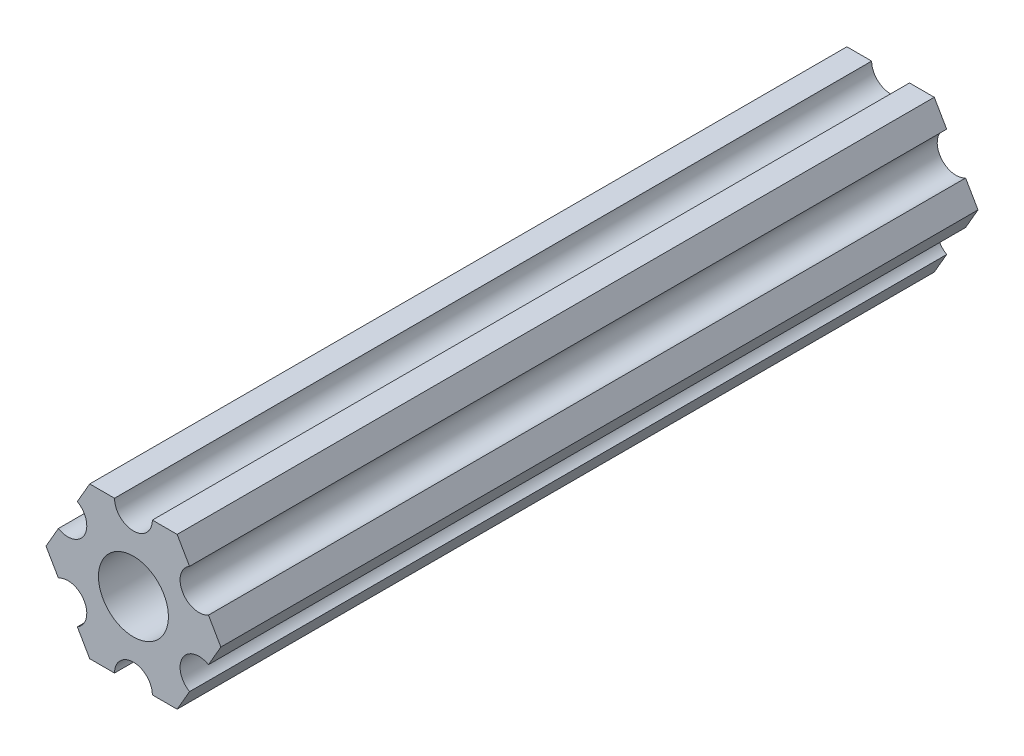
ISO-10303-21;
HEADER;
FILE_DESCRIPTION(('STEP AP214'),'2;1');
FILE_NAME('part.step','',(''),(''),'','','');
FILE_SCHEMA(('AUTOMOTIVE_DESIGN { 1 0 10303 214 1 1 1 1 }'));
ENDSEC;
DATA;
#1=APPLICATION_CONTEXT('core data for automotive mechanical design processes');
#2=APPLICATION_PROTOCOL_DEFINITION('international standard','automotive_design',2000,#1);
#3=PRODUCT_CONTEXT('',#1,'mechanical');
#4=PRODUCT('Part','Part','',(#3));
#5=PRODUCT_RELATED_PRODUCT_CATEGORY('part','',(#4));
#6=PRODUCT_DEFINITION_FORMATION('','',#4);
#7=PRODUCT_DEFINITION_CONTEXT('part definition',#1,'design');
#8=PRODUCT_DEFINITION('design','',#6,#7);
#9=PRODUCT_DEFINITION_SHAPE('','',#8);
#10=(LENGTH_UNIT() NAMED_UNIT(*) SI_UNIT(.MILLI.,.METRE.));
#11=(NAMED_UNIT(*) PLANE_ANGLE_UNIT() SI_UNIT($,.RADIAN.));
#12=(NAMED_UNIT(*) SI_UNIT($,.STERADIAN.) SOLID_ANGLE_UNIT());
#13=UNCERTAINTY_MEASURE_WITH_UNIT(LENGTH_MEASURE(1.E-05),#10,'distance_accuracy_value','');
#14=(GEOMETRIC_REPRESENTATION_CONTEXT(3) GLOBAL_UNCERTAINTY_ASSIGNED_CONTEXT((#13)) GLOBAL_UNIT_ASSIGNED_CONTEXT((#10,
#11,#12)) REPRESENTATION_CONTEXT('',''));
#15=CARTESIAN_POINT('',(0.,0.,0.));
#16=DIRECTION('',(0.,0.,1.));
#17=DIRECTION('',(1.,0.,0.));
#18=AXIS2_PLACEMENT_3D('',#15,#16,#17);
#19=CARTESIAN_POINT('',(5.49926169873049,-3.17500022210629,241.3));
#20=DIRECTION('',(0.,0.,1.));
#21=DIRECTION('',(1.,0.,0.));
#22=AXIS2_PLACEMENT_3D('',#19,#20,#21);
#23=CYLINDRICAL_SURFACE('',#22,1.5875);
#24=CARTESIAN_POINT('',(5.49926169873049,-3.17500022210629,304.8));
#25=DIRECTION('',(0.,0.,-1.));
#26=DIRECTION('',(-1.,0.,0.));
#27=AXIS2_PLACEMENT_3D('',#24,#25,#26);
#28=CIRCLE('',#27,1.5875);
#29=CARTESIAN_POINT('',(4.7055116987305,-4.5498155506141,304.8));
#30=VERTEX_POINT('',#29);
#31=CARTESIAN_POINT('',(6.29301169873047,-1.80018489359848,304.8));
#32=VERTEX_POINT('',#31);
#33=EDGE_CURVE('E193',#30,#32,#28,.T.);
#34=ORIENTED_EDGE('',*,*,#33,.F.);
#35=DIRECTION('',(0.,0.,1.));
#36=VECTOR('',#35,1.);
#37=CARTESIAN_POINT('',(4.7055116987305,-4.5498155506141,241.3));
#38=LINE('',#37,#36);
#39=CARTESIAN_POINT('',(4.7055116987305,-4.5498155506141,241.3));
#40=VERTEX_POINT('',#39);
#41=EDGE_CURVE('E11',#40,#30,#38,.T.);
#42=ORIENTED_EDGE('',*,*,#41,.F.);
#43=CARTESIAN_POINT('',(5.49926169873049,-3.17500022210629,241.3));
#44=DIRECTION('',(0.,0.,-1.));
#45=DIRECTION('',(-1.,0.,0.));
#46=AXIS2_PLACEMENT_3D('',#43,#44,#45);
#47=CIRCLE('',#46,1.5875);
#48=CARTESIAN_POINT('',(6.29301169873047,-1.80018489359848,241.3));
#49=VERTEX_POINT('',#48);
#50=EDGE_CURVE('E244',#40,#49,#47,.T.);
#51=ORIENTED_EDGE('',*,*,#50,.T.);
#52=DIRECTION('',(0.,0.,1.));
#53=VECTOR('',#52,1.);
#54=CARTESIAN_POINT('',(6.29301169873047,-1.80018489359848,241.3));
#55=LINE('',#54,#53);
#56=EDGE_CURVE('E39',#49,#32,#55,.T.);
#57=ORIENTED_EDGE('',*,*,#56,.T.);
#58=EDGE_LOOP('',(#34,#42,#51,#57));
#59=FACE_BOUND('',#58,.T.);
#60=ADVANCED_FACE('F36',(#59),#23,.F.);
#61=CARTESIAN_POINT('',(3.6661745940535,-6.35000022210627,241.3));
#62=DIRECTION('',(0.866025403784446,-0.499999999999988,0.));
#63=DIRECTION('',(0.499999999999988,0.866025403784446,0.));
#64=AXIS2_PLACEMENT_3D('',#61,#62,#63);
#65=PLANE('',#64);
#66=DIRECTION('',(0.499999999999988,0.866025403784446,0.));
#67=VECTOR('',#66,1.);
#68=CARTESIAN_POINT('',(3.6661745940535,-6.35000022210627,304.8));
#69=LINE('',#68,#67);
#70=CARTESIAN_POINT('',(3.6661745940535,-6.35000022210627,304.8));
#71=VERTEX_POINT('',#70);
#72=EDGE_CURVE('E242',#71,#30,#69,.T.);
#73=ORIENTED_EDGE('',*,*,#72,.F.);
#74=DIRECTION('',(0.,0.,1.));
#75=VECTOR('',#74,1.);
#76=CARTESIAN_POINT('',(3.6661745940535,-6.35000022210627,241.3));
#77=LINE('',#76,#75);
#78=CARTESIAN_POINT('',(3.6661745940535,-6.35000022210627,241.3));
#79=VERTEX_POINT('',#78);
#80=EDGE_CURVE('E45',#79,#71,#77,.T.);
#81=ORIENTED_EDGE('',*,*,#80,.F.);
#82=DIRECTION('',(0.499999999999988,0.866025403784446,0.));
#83=VECTOR('',#82,1.);
#84=CARTESIAN_POINT('',(3.6661745940535,-6.35000022210627,241.3));
#85=LINE('',#84,#83);
#86=EDGE_CURVE('E183',#79,#40,#85,.T.);
#87=ORIENTED_EDGE('',*,*,#86,.T.);
#88=ORIENTED_EDGE('',*,*,#41,.T.);
#89=EDGE_LOOP('',(#73,#81,#87,#88));
#90=FACE_BOUND('',#89,.T.);
#91=ADVANCED_FACE('F276',(#90),#65,.T.);
#92=CARTESIAN_POINT('',(1.58750038469929,-6.35000022210627,241.3));
#93=DIRECTION('',(0.,-1.,0.));
#94=DIRECTION('',(0.,0.,-1.));
#95=AXIS2_PLACEMENT_3D('',#92,#93,#94);
#96=PLANE('',#95);
#97=DIRECTION('',(1.,0.,0.));
#98=VECTOR('',#97,1.);
#99=CARTESIAN_POINT('',(1.58750038469929,-6.35000022210627,304.8));
#100=LINE('',#99,#98);
#101=CARTESIAN_POINT('',(1.58750038469929,-6.35000022210627,304.8));
#102=VERTEX_POINT('',#101);
#103=EDGE_CURVE('E170',#102,#71,#100,.T.);
#104=ORIENTED_EDGE('',*,*,#103,.F.);
#105=DIRECTION('',(0.,0.,1.));
#106=VECTOR('',#105,1.);
#107=CARTESIAN_POINT('',(1.58750038469929,-6.35000022210627,241.3));
#108=LINE('',#107,#106);
#109=CARTESIAN_POINT('',(1.58750038469929,-6.35000022210627,241.3));
#110=VERTEX_POINT('',#109);
#111=EDGE_CURVE('E165',#110,#102,#108,.T.);
#112=ORIENTED_EDGE('',*,*,#111,.F.);
#113=DIRECTION('',(1.,0.,0.));
#114=VECTOR('',#113,1.);
#115=CARTESIAN_POINT('',(1.58750038469929,-6.35000022210627,241.3));
#116=LINE('',#115,#114);
#117=EDGE_CURVE('E168',#110,#79,#116,.T.);
#118=ORIENTED_EDGE('',*,*,#117,.T.);
#119=ORIENTED_EDGE('',*,*,#80,.T.);
#120=EDGE_LOOP('',(#104,#112,#118,#119));
#121=FACE_BOUND('',#120,.T.);
#122=ADVANCED_FACE('F167',(#121),#96,.T.);
#123=CARTESIAN_POINT('',(3.84699290671026E-07,-6.35000022210627,241.3));
#124=DIRECTION('',(0.,0.,1.));
#125=DIRECTION('',(1.,0.,0.));
#126=AXIS2_PLACEMENT_3D('',#123,#124,#125);
#127=CYLINDRICAL_SURFACE('',#126,1.5875);
#128=CARTESIAN_POINT('',(3.84699290671026E-07,-6.35000022210627,304.8));
#129=DIRECTION('',(0.,0.,-1.));
#130=DIRECTION('',(-1.,0.,0.));
#131=AXIS2_PLACEMENT_3D('',#128,#129,#130);
#132=CIRCLE('',#131,1.5875);
#133=CARTESIAN_POINT('',(-1.58749961530071,-6.35000022210627,304.8));
#134=VERTEX_POINT('',#133);
#135=EDGE_CURVE('E239',#134,#102,#132,.T.);
#136=ORIENTED_EDGE('',*,*,#135,.F.);
#137=DIRECTION('',(0.,0.,1.));
#138=VECTOR('',#137,1.);
#139=CARTESIAN_POINT('',(-1.58749961530071,-6.35000022210627,241.3));
#140=LINE('',#139,#138);
#141=CARTESIAN_POINT('',(-1.58749961530071,-6.35000022210627,241.3));
#142=VERTEX_POINT('',#141);
#143=EDGE_CURVE('E175',#142,#134,#140,.T.);
#144=ORIENTED_EDGE('',*,*,#143,.F.);
#145=CARTESIAN_POINT('',(3.84699290671026E-07,-6.35000022210627,241.3));
#146=DIRECTION('',(0.,0.,-1.));
#147=DIRECTION('',(-1.,0.,0.));
#148=AXIS2_PLACEMENT_3D('',#145,#146,#147);
#149=CIRCLE('',#148,1.5875);
#150=EDGE_CURVE('E181',#142,#110,#149,.T.);
#151=ORIENTED_EDGE('',*,*,#150,.T.);
#152=ORIENTED_EDGE('',*,*,#111,.T.);
#153=EDGE_LOOP('',(#136,#144,#151,#152));
#154=FACE_BOUND('',#153,.T.);
#155=ADVANCED_FACE('F185',(#154),#127,.F.);
#156=CARTESIAN_POINT('',(-3.66617382465478,-6.35000022210627,241.3));
#157=DIRECTION('',(0.,-1.,0.));
#158=DIRECTION('',(1.,0.,0.));
#159=AXIS2_PLACEMENT_3D('',#156,#157,#158);
#160=PLANE('',#159);
#161=DIRECTION('',(1.,0.,0.));
#162=VECTOR('',#161,1.);
#163=CARTESIAN_POINT('',(-3.66617382465478,-6.35000022210627,304.8));
#164=LINE('',#163,#162);
#165=CARTESIAN_POINT('',(-3.66617382465478,-6.35000022210627,304.8));
#166=VERTEX_POINT('',#165);
#167=EDGE_CURVE('E236',#166,#134,#164,.T.);
#168=ORIENTED_EDGE('',*,*,#167,.F.);
#169=DIRECTION('',(0.,0.,1.));
#170=VECTOR('',#169,1.);
#171=CARTESIAN_POINT('',(-3.66617382465478,-6.35000022210627,241.3));
#172=LINE('',#171,#170);
#173=CARTESIAN_POINT('',(-3.66617382465478,-6.35000022210627,241.3));
#174=VERTEX_POINT('',#173);
#175=EDGE_CURVE('E248',#174,#166,#172,.T.);
#176=ORIENTED_EDGE('',*,*,#175,.F.);
#177=DIRECTION('',(1.,0.,0.));
#178=VECTOR('',#177,1.);
#179=CARTESIAN_POINT('',(-3.66617382465478,-6.35000022210627,241.3));
#180=LINE('',#179,#178);
#181=EDGE_CURVE('E186',#174,#142,#180,.T.);
#182=ORIENTED_EDGE('',*,*,#181,.T.);
#183=ORIENTED_EDGE('',*,*,#143,.T.);
#184=EDGE_LOOP('',(#168,#176,#182,#183));
#185=FACE_BOUND('',#184,.T.);
#186=ADVANCED_FACE('F289',(#185),#160,.T.);
#187=CARTESIAN_POINT('',(-4.70551103839171,-4.54981561357971,241.3));
#188=DIRECTION('',(-0.866025373493149,-0.500000052466048,0.));
#189=DIRECTION('',(0.500000052466048,-0.866025373493149,0.));
#190=AXIS2_PLACEMENT_3D('',#187,#188,#189);
#191=PLANE('',#190);
#192=DIRECTION('',(0.500000052466048,-0.866025373493149,0.));
#193=VECTOR('',#192,1.);
#194=CARTESIAN_POINT('',(-4.70551103839171,-4.54981561357971,304.8));
#195=LINE('',#194,#193);
#196=CARTESIAN_POINT('',(-4.70551103839171,-4.54981561357971,304.8));
#197=VERTEX_POINT('',#196);
#198=EDGE_CURVE('E233',#197,#166,#195,.T.);
#199=ORIENTED_EDGE('',*,*,#198,.F.);
#200=DIRECTION('',(0.,0.,1.));
#201=VECTOR('',#200,1.);
#202=CARTESIAN_POINT('',(-4.70551103839171,-4.54981561357971,241.3));
#203=LINE('',#202,#201);
#204=CARTESIAN_POINT('',(-4.70551103839171,-4.54981561357971,241.3));
#205=VERTEX_POINT('',#204);
#206=EDGE_CURVE('E250',#205,#197,#203,.T.);
#207=ORIENTED_EDGE('',*,*,#206,.F.);
#208=DIRECTION('',(0.500000052466048,-0.866025373493149,0.));
#209=VECTOR('',#208,1.);
#210=CARTESIAN_POINT('',(-4.70551103839171,-4.54981561357971,241.3));
#211=LINE('',#210,#209);
#212=EDGE_CURVE('E188',#205,#174,#211,.T.);
#213=ORIENTED_EDGE('',*,*,#212,.T.);
#214=ORIENTED_EDGE('',*,*,#175,.T.);
#215=EDGE_LOOP('',(#199,#207,#213,#214));
#216=FACE_BOUND('',#215,.T.);
#217=ADVANCED_FACE('F292',(#216),#191,.T.);
#218=CARTESIAN_POINT('',(-5.49926112168156,-3.17500033315934,241.3));
#219=DIRECTION('',(0.,0.,1.));
#220=DIRECTION('',(1.,0.,0.));
#221=AXIS2_PLACEMENT_3D('',#218,#219,#220);
#222=CYLINDRICAL_SURFACE('',#221,1.5875);
#223=CARTESIAN_POINT('',(-5.49926112168156,-3.17500033315934,304.8));
#224=DIRECTION('',(0.,0.,-1.));
#225=DIRECTION('',(-1.,0.,0.));
#226=AXIS2_PLACEMENT_3D('',#223,#224,#225);
#227=CIRCLE('',#226,1.5875);
#228=CARTESIAN_POINT('',(-6.29301120497141,-1.80018505273897,304.8));
#229=VERTEX_POINT('',#228);
#230=EDGE_CURVE('E230',#229,#197,#227,.T.);
#231=ORIENTED_EDGE('',*,*,#230,.F.);
#232=DIRECTION('',(0.,0.,1.));
#233=VECTOR('',#232,1.);
#234=CARTESIAN_POINT('',(-6.29301120497141,-1.80018505273897,241.3));
#235=LINE('',#234,#233);
#236=CARTESIAN_POINT('',(-6.29301120497141,-1.80018505273897,241.3));
#237=VERTEX_POINT('',#236);
#238=EDGE_CURVE('E252',#237,#229,#235,.T.);
#239=ORIENTED_EDGE('',*,*,#238,.F.);
#240=CARTESIAN_POINT('',(-5.49926112168156,-3.17500033315934,241.3));
#241=DIRECTION('',(0.,0.,-1.));
#242=DIRECTION('',(-1.,0.,0.));
#243=AXIS2_PLACEMENT_3D('',#240,#241,#242);
#244=CIRCLE('',#243,1.5875);
#245=EDGE_CURVE('E397',#237,#205,#244,.T.);
#246=ORIENTED_EDGE('',*,*,#245,.T.);
#247=ORIENTED_EDGE('',*,*,#206,.T.);
#248=EDGE_LOOP('',(#231,#239,#246,#247));
#249=FACE_BOUND('',#248,.T.);
#250=ADVANCED_FACE('F296',(#249),#222,.F.);
#251=CARTESIAN_POINT('',(-7.33234841870827,-4.44212523790841E-07,241.3));
#252=DIRECTION('',(-0.866025373493149,-0.500000052466048,0.));
#253=DIRECTION('',(0.500000052466048,-0.86602537349315,0.));
#254=AXIS2_PLACEMENT_3D('',#251,#252,#253);
#255=PLANE('',#254);
#256=DIRECTION('',(0.500000052466048,-0.86602537349315,0.));
#257=VECTOR('',#256,1.);
#258=CARTESIAN_POINT('',(-7.33234841870827,-4.44212523790841E-07,304.8));
#259=LINE('',#258,#257);
#260=CARTESIAN_POINT('',(-7.33234841870827,-4.44212523790841E-07,304.8));
#261=VERTEX_POINT('',#260);
#262=EDGE_CURVE('E227',#261,#229,#259,.T.);
#263=ORIENTED_EDGE('',*,*,#262,.F.);
#264=DIRECTION('',(0.,0.,1.));
#265=VECTOR('',#264,1.);
#266=CARTESIAN_POINT('',(-7.33234841870827,-4.44212523790841E-07,241.3));
#267=LINE('',#266,#265);
#268=CARTESIAN_POINT('',(-7.33234841870827,-4.44212523790841E-07,241.3));
#269=VERTEX_POINT('',#268);
#270=EDGE_CURVE('E254',#269,#261,#267,.T.);
#271=ORIENTED_EDGE('',*,*,#270,.F.);
#272=DIRECTION('',(0.500000052466048,-0.86602537349315,0.));
#273=VECTOR('',#272,1.);
#274=CARTESIAN_POINT('',(-7.33234841870827,-4.44212523790841E-07,241.3));
#275=LINE('',#274,#273);
#276=EDGE_CURVE('E394',#269,#237,#275,.T.);
#277=ORIENTED_EDGE('',*,*,#276,.T.);
#278=ORIENTED_EDGE('',*,*,#238,.T.);
#279=EDGE_LOOP('',(#263,#271,#277,#278));
#280=FACE_BOUND('',#279,.T.);
#281=ADVANCED_FACE('F300',(#280),#255,.T.);
#282=CARTESIAN_POINT('',(-6.29301142309098,1.80018429024547,241.3));
#283=DIRECTION('',(-0.866025434075722,0.499999947533955,0.));
#284=DIRECTION('',(-0.499999947533955,-0.866025434075722,0.));
#285=AXIS2_PLACEMENT_3D('',#282,#283,#284);
#286=PLANE('',#285);
#287=DIRECTION('',(-0.499999947533955,-0.866025434075722,0.));
#288=VECTOR('',#287,1.);
#289=CARTESIAN_POINT('',(-6.29301142309098,1.80018429024547,304.8));
#290=LINE('',#289,#288);
#291=CARTESIAN_POINT('',(-6.29301142309098,1.80018429024546,304.8));
#292=VERTEX_POINT('',#291);
#293=EDGE_CURVE('E224',#292,#261,#290,.T.);
#294=ORIENTED_EDGE('',*,*,#293,.F.);
#295=DIRECTION('',(0.,0.,1.));
#296=VECTOR('',#295,1.);
#297=CARTESIAN_POINT('',(-6.29301142309098,1.80018429024546,241.3));
#298=LINE('',#297,#296);
#299=CARTESIAN_POINT('',(-6.29301142309098,1.80018429024546,241.3));
#300=VERTEX_POINT('',#299);
#301=EDGE_CURVE('E256',#300,#292,#298,.T.);
#302=ORIENTED_EDGE('',*,*,#301,.F.);
#303=DIRECTION('',(-0.499999947533955,-0.866025434075722,0.));
#304=VECTOR('',#303,1.);
#305=CARTESIAN_POINT('',(-6.29301142309098,1.80018429024547,241.3));
#306=LINE('',#305,#304);
#307=EDGE_CURVE('E391',#300,#269,#306,.T.);
#308=ORIENTED_EDGE('',*,*,#307,.T.);
#309=ORIENTED_EDGE('',*,*,#270,.T.);
#310=EDGE_LOOP('',(#294,#302,#308,#309));
#311=FACE_BOUND('',#310,.T.);
#312=ADVANCED_FACE('F304',(#311),#286,.T.);
#313=CARTESIAN_POINT('',(-5.49926150638083,3.17499966684067,241.3));
#314=DIRECTION('',(0.,0.,1.));
#315=DIRECTION('',(1.,0.,0.));
#316=AXIS2_PLACEMENT_3D('',#313,#314,#315);
#317=CYLINDRICAL_SURFACE('',#316,1.5875);
#318=CARTESIAN_POINT('',(-5.49926150638083,3.17499966684067,304.8));
#319=DIRECTION('',(0.,0.,-1.));
#320=DIRECTION('',(-1.,0.,0.));
#321=AXIS2_PLACEMENT_3D('',#318,#319,#320);
#322=CIRCLE('',#321,1.5875);
#323=CARTESIAN_POINT('',(-4.70551158967067,4.54981504343588,304.8));
#324=VERTEX_POINT('',#323);
#325=EDGE_CURVE('E221',#324,#292,#322,.T.);
#326=ORIENTED_EDGE('',*,*,#325,.F.);
#327=DIRECTION('',(0.,0.,1.));
#328=VECTOR('',#327,1.);
#329=CARTESIAN_POINT('',(-4.70551158967067,4.54981504343588,241.3));
#330=LINE('',#329,#328);
#331=CARTESIAN_POINT('',(-4.70551158967067,4.54981504343588,241.3));
#332=VERTEX_POINT('',#331);
#333=EDGE_CURVE('E258',#332,#324,#330,.T.);
#334=ORIENTED_EDGE('',*,*,#333,.F.);
#335=CARTESIAN_POINT('',(-5.49926150638083,3.17499966684067,241.3));
#336=DIRECTION('',(0.,0.,-1.));
#337=DIRECTION('',(-1.,0.,0.));
#338=AXIS2_PLACEMENT_3D('',#335,#336,#337);
#339=CIRCLE('',#338,1.5875);
#340=EDGE_CURVE('E388',#332,#300,#339,.T.);
#341=ORIENTED_EDGE('',*,*,#340,.T.);
#342=ORIENTED_EDGE('',*,*,#301,.T.);
#343=EDGE_LOOP('',(#326,#334,#341,#342));
#344=FACE_BOUND('',#343,.T.);
#345=ADVANCED_FACE('F308',(#344),#317,.F.);
#346=CARTESIAN_POINT('',(-3.66617459405348,6.3499997778937,241.3));
#347=DIRECTION('',(-0.866025434075722,0.499999947533955,0.));
#348=DIRECTION('',(-0.499999947533955,-0.866025434075722,0.));
#349=AXIS2_PLACEMENT_3D('',#346,#347,#348);
#350=PLANE('',#349);
#351=DIRECTION('',(-0.499999947533955,-0.866025434075722,0.));
#352=VECTOR('',#351,1.);
#353=CARTESIAN_POINT('',(-3.66617459405348,6.3499997778937,304.8));
#354=LINE('',#353,#352);
#355=CARTESIAN_POINT('',(-3.66617459405348,6.3499997778937,304.8));
#356=VERTEX_POINT('',#355);
#357=EDGE_CURVE('E218',#356,#324,#354,.T.);
#358=ORIENTED_EDGE('',*,*,#357,.F.);
#359=DIRECTION('',(0.,0.,1.));
#360=VECTOR('',#359,1.);
#361=CARTESIAN_POINT('',(-3.66617459405348,6.3499997778937,241.3));
#362=LINE('',#361,#360);
#363=CARTESIAN_POINT('',(-3.66617459405348,6.3499997778937,241.3));
#364=VERTEX_POINT('',#363);
#365=EDGE_CURVE('E260',#364,#356,#362,.T.);
#366=ORIENTED_EDGE('',*,*,#365,.F.);
#367=DIRECTION('',(-0.499999947533955,-0.866025434075722,0.));
#368=VECTOR('',#367,1.);
#369=CARTESIAN_POINT('',(-3.66617459405348,6.3499997778937,241.3));
#370=LINE('',#369,#368);
#371=EDGE_CURVE('E385',#364,#332,#370,.T.);
#372=ORIENTED_EDGE('',*,*,#371,.T.);
#373=ORIENTED_EDGE('',*,*,#333,.T.);
#374=EDGE_LOOP('',(#358,#366,#372,#373));
#375=FACE_BOUND('',#374,.T.);
#376=ADVANCED_FACE('F312',(#375),#350,.T.);
#377=CARTESIAN_POINT('',(-1.58750038469926,6.3499997778937,241.3));
#378=DIRECTION('',(0.,1.,0.));
#379=DIRECTION('',(0.,0.,1.));
#380=AXIS2_PLACEMENT_3D('',#377,#378,#379);
#381=PLANE('',#380);
#382=DIRECTION('',(-1.,0.,0.));
#383=VECTOR('',#382,1.);
#384=CARTESIAN_POINT('',(-1.58750038469926,6.3499997778937,304.8));
#385=LINE('',#384,#383);
#386=CARTESIAN_POINT('',(-1.58750038469926,6.3499997778937,304.8));
#387=VERTEX_POINT('',#386);
#388=EDGE_CURVE('E215',#387,#356,#385,.T.);
#389=ORIENTED_EDGE('',*,*,#388,.F.);
#390=DIRECTION('',(0.,0.,1.));
#391=VECTOR('',#390,1.);
#392=CARTESIAN_POINT('',(-1.58750038469926,6.3499997778937,241.3));
#393=LINE('',#392,#391);
#394=CARTESIAN_POINT('',(-1.58750038469926,6.3499997778937,241.3));
#395=VERTEX_POINT('',#394);
#396=EDGE_CURVE('E262',#395,#387,#393,.T.);
#397=ORIENTED_EDGE('',*,*,#396,.F.);
#398=DIRECTION('',(-1.,0.,0.));
#399=VECTOR('',#398,1.);
#400=CARTESIAN_POINT('',(-1.58750038469926,6.3499997778937,241.3));
#401=LINE('',#400,#399);
#402=EDGE_CURVE('E382',#395,#364,#401,.T.);
#403=ORIENTED_EDGE('',*,*,#402,.T.);
#404=ORIENTED_EDGE('',*,*,#365,.T.);
#405=EDGE_LOOP('',(#389,#397,#403,#404));
#406=FACE_BOUND('',#405,.T.);
#407=ADVANCED_FACE('F316',(#406),#381,.T.);
#408=CARTESIAN_POINT('',(-3.84699252021695E-07,6.3499997778937,241.3));
#409=DIRECTION('',(0.,0.,1.));
#410=DIRECTION('',(1.,0.,0.));
#411=AXIS2_PLACEMENT_3D('',#408,#409,#410);
#412=CYLINDRICAL_SURFACE('',#411,1.5875);
#413=CARTESIAN_POINT('',(-3.84699252021695E-07,6.3499997778937,304.8));
#414=DIRECTION('',(0.,0.,-1.));
#415=DIRECTION('',(-1.,0.,0.));
#416=AXIS2_PLACEMENT_3D('',#413,#414,#415);
#417=CIRCLE('',#416,1.5875);
#418=CARTESIAN_POINT('',(1.58749961530075,6.3499997778937,304.8));
#419=VERTEX_POINT('',#418);
#420=EDGE_CURVE('E212',#419,#387,#417,.T.);
#421=ORIENTED_EDGE('',*,*,#420,.F.);
#422=DIRECTION('',(0.,0.,1.));
#423=VECTOR('',#422,1.);
#424=CARTESIAN_POINT('',(1.58749961530075,6.3499997778937,241.3));
#425=LINE('',#424,#423);
#426=CARTESIAN_POINT('',(1.58749961530075,6.3499997778937,241.3));
#427=VERTEX_POINT('',#426);
#428=EDGE_CURVE('E264',#427,#419,#425,.T.);
#429=ORIENTED_EDGE('',*,*,#428,.F.);
#430=CARTESIAN_POINT('',(-3.84699252021695E-07,6.3499997778937,241.3));
#431=DIRECTION('',(0.,0.,-1.));
#432=DIRECTION('',(-1.,0.,0.));
#433=AXIS2_PLACEMENT_3D('',#430,#431,#432);
#434=CIRCLE('',#433,1.5875);
#435=EDGE_CURVE('E379',#427,#395,#434,.T.);
#436=ORIENTED_EDGE('',*,*,#435,.T.);
#437=ORIENTED_EDGE('',*,*,#396,.T.);
#438=EDGE_LOOP('',(#421,#429,#436,#437));
#439=FACE_BOUND('',#438,.T.);
#440=ADVANCED_FACE('F320',(#439),#412,.F.);
#441=CARTESIAN_POINT('',(3.66617382465482,6.3499997778937,241.3));
#442=DIRECTION('',(0.,1.,0.));
#443=DIRECTION('',(0.,0.,1.));
#444=AXIS2_PLACEMENT_3D('',#441,#442,#443);
#445=PLANE('',#444);
#446=DIRECTION('',(-1.,0.,0.));
#447=VECTOR('',#446,1.);
#448=CARTESIAN_POINT('',(3.66617382465482,6.3499997778937,304.8));
#449=LINE('',#448,#447);
#450=CARTESIAN_POINT('',(3.66617382465482,6.3499997778937,304.8));
#451=VERTEX_POINT('',#450);
#452=EDGE_CURVE('E209',#451,#419,#449,.T.);
#453=ORIENTED_EDGE('',*,*,#452,.F.);
#454=DIRECTION('',(0.,0.,1.));
#455=VECTOR('',#454,1.);
#456=CARTESIAN_POINT('',(3.66617382465482,6.3499997778937,241.3));
#457=LINE('',#456,#455);
#458=CARTESIAN_POINT('',(3.66617382465482,6.3499997778937,241.3));
#459=VERTEX_POINT('',#458);
#460=EDGE_CURVE('E266',#459,#451,#457,.T.);
#461=ORIENTED_EDGE('',*,*,#460,.F.);
#462=DIRECTION('',(-1.,0.,0.));
#463=VECTOR('',#462,1.);
#464=CARTESIAN_POINT('',(3.66617382465482,6.3499997778937,241.3));
#465=LINE('',#464,#463);
#466=EDGE_CURVE('E376',#459,#427,#465,.T.);
#467=ORIENTED_EDGE('',*,*,#466,.T.);
#468=ORIENTED_EDGE('',*,*,#428,.T.);
#469=EDGE_LOOP('',(#453,#461,#467,#468));
#470=FACE_BOUND('',#469,.T.);
#471=ADVANCED_FACE('F324',(#470),#445,.T.);
#472=CARTESIAN_POINT('',(4.70551118909645,4.54981503427037,241.3));
#473=DIRECTION('',(0.866025358347508,0.500000078699064,0.));
#474=DIRECTION('',(-0.500000078699064,0.866025358347508,0.));
#475=AXIS2_PLACEMENT_3D('',#472,#473,#474);
#476=PLANE('',#475);
#477=DIRECTION('',(-0.500000078699064,0.866025358347508,0.));
#478=VECTOR('',#477,1.);
#479=CARTESIAN_POINT('',(4.70551118909645,4.54981503427037,304.8));
#480=LINE('',#479,#478);
#481=CARTESIAN_POINT('',(4.70551118909645,4.54981503427037,304.8));
#482=VERTEX_POINT('',#481);
#483=EDGE_CURVE('E206',#482,#451,#480,.T.);
#484=ORIENTED_EDGE('',*,*,#483,.F.);
#485=DIRECTION('',(0.,0.,1.));
#486=VECTOR('',#485,1.);
#487=CARTESIAN_POINT('',(4.70551118909645,4.54981503427037,241.3));
#488=LINE('',#487,#486);
#489=CARTESIAN_POINT('',(4.70551118909645,4.54981503427037,241.3));
#490=VERTEX_POINT('',#489);
#491=EDGE_CURVE('E268',#490,#482,#488,.T.);
#492=ORIENTED_EDGE('',*,*,#491,.F.);
#493=DIRECTION('',(-0.500000078699064,0.866025358347508,0.));
#494=VECTOR('',#493,1.);
#495=CARTESIAN_POINT('',(4.70551118909645,4.54981503427037,241.3));
#496=LINE('',#495,#494);
#497=EDGE_CURVE('E373',#490,#459,#496,.T.);
#498=ORIENTED_EDGE('',*,*,#497,.T.);
#499=ORIENTED_EDGE('',*,*,#460,.T.);
#500=EDGE_LOOP('',(#484,#492,#498,#499));
#501=FACE_BOUND('',#500,.T.);
#502=ADVANCED_FACE('F328',(#501),#476,.T.);
#503=CARTESIAN_POINT('',(5.49926131403121,3.1749997778937,241.3));
#504=DIRECTION('',(0.,0.,1.));
#505=DIRECTION('',(1.,0.,0.));
#506=AXIS2_PLACEMENT_3D('',#503,#504,#505);
#507=CYLINDRICAL_SURFACE('',#506,1.5875);
#508=CARTESIAN_POINT('',(5.49926131403121,3.1749997778937,304.8));
#509=DIRECTION('',(0.,0.,-1.));
#510=DIRECTION('',(-1.,0.,0.));
#511=AXIS2_PLACEMENT_3D('',#508,#509,#510);
#512=CIRCLE('',#511,1.5875);
#513=CARTESIAN_POINT('',(6.29301143896598,1.80018452151703,304.8));
#514=VERTEX_POINT('',#513);
#515=EDGE_CURVE('E203',#514,#482,#512,.T.);
#516=ORIENTED_EDGE('',*,*,#515,.F.);
#517=DIRECTION('',(0.,0.,1.));
#518=VECTOR('',#517,1.);
#519=CARTESIAN_POINT('',(6.29301143896598,1.80018452151703,241.3));
#520=LINE('',#519,#518);
#521=CARTESIAN_POINT('',(6.29301143896598,1.80018452151703,241.3));
#522=VERTEX_POINT('',#521);
#523=EDGE_CURVE('E270',#522,#514,#520,.T.);
#524=ORIENTED_EDGE('',*,*,#523,.F.);
#525=CARTESIAN_POINT('',(5.49926131403121,3.1749997778937,241.3));
#526=DIRECTION('',(0.,0.,-1.));
#527=DIRECTION('',(-1.,0.,0.));
#528=AXIS2_PLACEMENT_3D('',#525,#526,#527);
#529=CIRCLE('',#528,1.5875);
#530=EDGE_CURVE('E370',#522,#490,#529,.T.);
#531=ORIENTED_EDGE('',*,*,#530,.T.);
#532=ORIENTED_EDGE('',*,*,#491,.T.);
#533=EDGE_LOOP('',(#516,#524,#531,#532));
#534=FACE_BOUND('',#533,.T.);
#535=ADVANCED_FACE('F332',(#534),#507,.F.);
#536=CARTESIAN_POINT('',(7.33234880340755,-2.22106190273918E-07,241.3));
#537=DIRECTION('',(0.866025358347509,0.500000078699063,0.));
#538=DIRECTION('',(-0.500000078699063,0.866025358347509,0.));
#539=AXIS2_PLACEMENT_3D('',#536,#537,#538);
#540=PLANE('',#539);
#541=DIRECTION('',(-0.500000078699063,0.866025358347509,0.));
#542=VECTOR('',#541,1.);
#543=CARTESIAN_POINT('',(7.33234880340755,-2.22106190273918E-07,304.8));
#544=LINE('',#543,#542);
#545=CARTESIAN_POINT('',(7.33234880340755,-2.22106190273918E-07,304.8));
#546=VERTEX_POINT('',#545);
#547=EDGE_CURVE('E200',#546,#514,#544,.T.);
#548=ORIENTED_EDGE('',*,*,#547,.F.);
#549=DIRECTION('',(0.,0.,1.));
#550=VECTOR('',#549,1.);
#551=CARTESIAN_POINT('',(7.33234880340755,-2.22106190273918E-07,241.3));
#552=LINE('',#551,#550);
#553=CARTESIAN_POINT('',(7.33234880340755,-2.22106190273918E-07,241.3));
#554=VERTEX_POINT('',#553);
#555=EDGE_CURVE('E271',#554,#546,#552,.T.);
#556=ORIENTED_EDGE('',*,*,#555,.F.);
#557=DIRECTION('',(-0.500000078699063,0.866025358347509,0.));
#558=VECTOR('',#557,1.);
#559=CARTESIAN_POINT('',(7.33234880340755,-2.22106190273918E-07,241.3));
#560=LINE('',#559,#558);
#561=EDGE_CURVE('E367',#554,#522,#560,.T.);
#562=ORIENTED_EDGE('',*,*,#561,.T.);
#563=ORIENTED_EDGE('',*,*,#523,.T.);
#564=EDGE_LOOP('',(#548,#556,#562,#563));
#565=FACE_BOUND('',#564,.T.);
#566=ADVANCED_FACE('F336',(#565),#540,.T.);
#567=CARTESIAN_POINT('',(6.29301169873047,-1.80018489359848,241.3));
#568=DIRECTION('',(0.866025403784446,-0.499999999999988,0.));
#569=DIRECTION('',(0.499999999999988,0.866025403784446,0.));
#570=AXIS2_PLACEMENT_3D('',#567,#568,#569);
#571=PLANE('',#570);
#572=DIRECTION('',(0.499999999999988,0.866025403784446,0.));
#573=VECTOR('',#572,1.);
#574=CARTESIAN_POINT('',(6.29301169873047,-1.80018489359848,304.8));
#575=LINE('',#574,#573);
#576=EDGE_CURVE('E196',#32,#546,#575,.T.);
#577=ORIENTED_EDGE('',*,*,#576,.F.);
#578=ORIENTED_EDGE('',*,*,#56,.F.);
#579=DIRECTION('',(0.499999999999988,0.866025403784446,0.));
#580=VECTOR('',#579,1.);
#581=CARTESIAN_POINT('',(6.29301169873047,-1.80018489359848,241.3));
#582=LINE('',#581,#580);
#583=EDGE_CURVE('E365',#49,#554,#582,.T.);
#584=ORIENTED_EDGE('',*,*,#583,.T.);
#585=ORIENTED_EDGE('',*,*,#555,.T.);
#586=EDGE_LOOP('',(#577,#578,#584,#585));
#587=FACE_BOUND('',#586,.T.);
#588=ADVANCED_FACE('F273',(#587),#571,.T.);
#589=CARTESIAN_POINT('',(5.49926169873049,-3.17500022210629,241.3));
#590=DIRECTION('',(0.,0.,-1.));
#591=DIRECTION('',(-1.,0.,0.));
#592=AXIS2_PLACEMENT_3D('',#589,#590,#591);
#593=PLANE('',#592);
#594=CARTESIAN_POINT('',(0.,0.,241.3));
#595=DIRECTION('',(0.,0.,1.));
#596=DIRECTION('',(-1.,0.,0.));
#597=AXIS2_PLACEMENT_3D('',#594,#595,#596);
#598=CIRCLE('',#597,2.9337);
#599=CARTESIAN_POINT('',(-2.9337,0.,241.3));
#600=VERTEX_POINT('',#599);
#601=EDGE_CURVE('E197',#600,#600,#598,.T.);
#602=ORIENTED_EDGE('',*,*,#601,.T.);
#603=EDGE_LOOP('',(#602));
#604=FACE_BOUND('',#603,.T.);
#605=ORIENTED_EDGE('',*,*,#50,.F.);
#606=ORIENTED_EDGE('',*,*,#86,.F.);
#607=ORIENTED_EDGE('',*,*,#117,.F.);
#608=ORIENTED_EDGE('',*,*,#150,.F.);
#609=ORIENTED_EDGE('',*,*,#181,.F.);
#610=ORIENTED_EDGE('',*,*,#212,.F.);
#611=ORIENTED_EDGE('',*,*,#245,.F.);
#612=ORIENTED_EDGE('',*,*,#276,.F.);
#613=ORIENTED_EDGE('',*,*,#307,.F.);
#614=ORIENTED_EDGE('',*,*,#340,.F.);
#615=ORIENTED_EDGE('',*,*,#371,.F.);
#616=ORIENTED_EDGE('',*,*,#402,.F.);
#617=ORIENTED_EDGE('',*,*,#435,.F.);
#618=ORIENTED_EDGE('',*,*,#466,.F.);
#619=ORIENTED_EDGE('',*,*,#497,.F.);
#620=ORIENTED_EDGE('',*,*,#530,.F.);
#621=ORIENTED_EDGE('',*,*,#561,.F.);
#622=ORIENTED_EDGE('',*,*,#583,.F.);
#623=EDGE_LOOP('',(#605,#606,#607,#608,#609,#610,#611,#612,#613,#614,#615,#616,#617,#618,#619,
#620,#621,#622));
#624=FACE_BOUND('',#623,.T.);
#625=ADVANCED_FACE('F179',(#604,#624),#593,.T.);
#626=CARTESIAN_POINT('',(5.49926169873049,-3.17500022210629,304.8));
#627=DIRECTION('',(0.,0.,-1.));
#628=DIRECTION('',(-1.,0.,0.));
#629=AXIS2_PLACEMENT_3D('',#626,#627,#628);
#630=PLANE('',#629);
#631=CARTESIAN_POINT('',(0.,0.,304.8));
#632=DIRECTION('',(0.,0.,1.));
#633=DIRECTION('',(-1.,0.,0.));
#634=AXIS2_PLACEMENT_3D('',#631,#632,#633);
#635=CIRCLE('',#634,2.9337);
#636=CARTESIAN_POINT('',(-2.9337,0.,304.8));
#637=VERTEX_POINT('',#636);
#638=EDGE_CURVE('E360',#637,#637,#635,.T.);
#639=ORIENTED_EDGE('',*,*,#638,.F.);
#640=EDGE_LOOP('',(#639));
#641=FACE_BOUND('',#640,.T.);
#642=ORIENTED_EDGE('',*,*,#33,.T.);
#643=ORIENTED_EDGE('',*,*,#576,.T.);
#644=ORIENTED_EDGE('',*,*,#547,.T.);
#645=ORIENTED_EDGE('',*,*,#515,.T.);
#646=ORIENTED_EDGE('',*,*,#483,.T.);
#647=ORIENTED_EDGE('',*,*,#452,.T.);
#648=ORIENTED_EDGE('',*,*,#420,.T.);
#649=ORIENTED_EDGE('',*,*,#388,.T.);
#650=ORIENTED_EDGE('',*,*,#357,.T.);
#651=ORIENTED_EDGE('',*,*,#325,.T.);
#652=ORIENTED_EDGE('',*,*,#293,.T.);
#653=ORIENTED_EDGE('',*,*,#262,.T.);
#654=ORIENTED_EDGE('',*,*,#230,.T.);
#655=ORIENTED_EDGE('',*,*,#198,.T.);
#656=ORIENTED_EDGE('',*,*,#167,.T.);
#657=ORIENTED_EDGE('',*,*,#135,.T.);
#658=ORIENTED_EDGE('',*,*,#103,.T.);
#659=ORIENTED_EDGE('',*,*,#72,.T.);
#660=EDGE_LOOP('',(#642,#643,#644,#645,#646,#647,#648,#649,#650,#651,#652,#653,#654,#655,#656,
#657,#658,#659));
#661=FACE_BOUND('',#660,.T.);
#662=ADVANCED_FACE('F275',(#641,#661),#630,.F.);
#663=CARTESIAN_POINT('',(0.,0.,241.3));
#664=DIRECTION('',(0.,0.,1.));
#665=DIRECTION('',(1.,0.,0.));
#666=AXIS2_PLACEMENT_3D('',#663,#664,#665);
#667=CYLINDRICAL_SURFACE('',#666,2.9337);
#668=ORIENTED_EDGE('',*,*,#601,.F.);
#669=EDGE_LOOP('',(#668));
#670=FACE_BOUND('',#669,.T.);
#671=ORIENTED_EDGE('',*,*,#638,.T.);
#672=EDGE_LOOP('',(#671));
#673=FACE_BOUND('',#672,.T.);
#674=ADVANCED_FACE('F348',(#670,#673),#667,.F.);
#675=CLOSED_SHELL('',(#60,#91,#122,#155,#186,#217,#250,#281,#312,#345,#376,#407,#440,#471,#502,
#535,#566,#588,#625,#662,#674));
#676=MANIFOLD_SOLID_BREP('B2',#675);
#677=ADVANCED_BREP_SHAPE_REPRESENTATION('',(#18,#676),#14);
#678=SHAPE_DEFINITION_REPRESENTATION(#9,#677);
ENDSEC;
END-ISO-10303-21;
